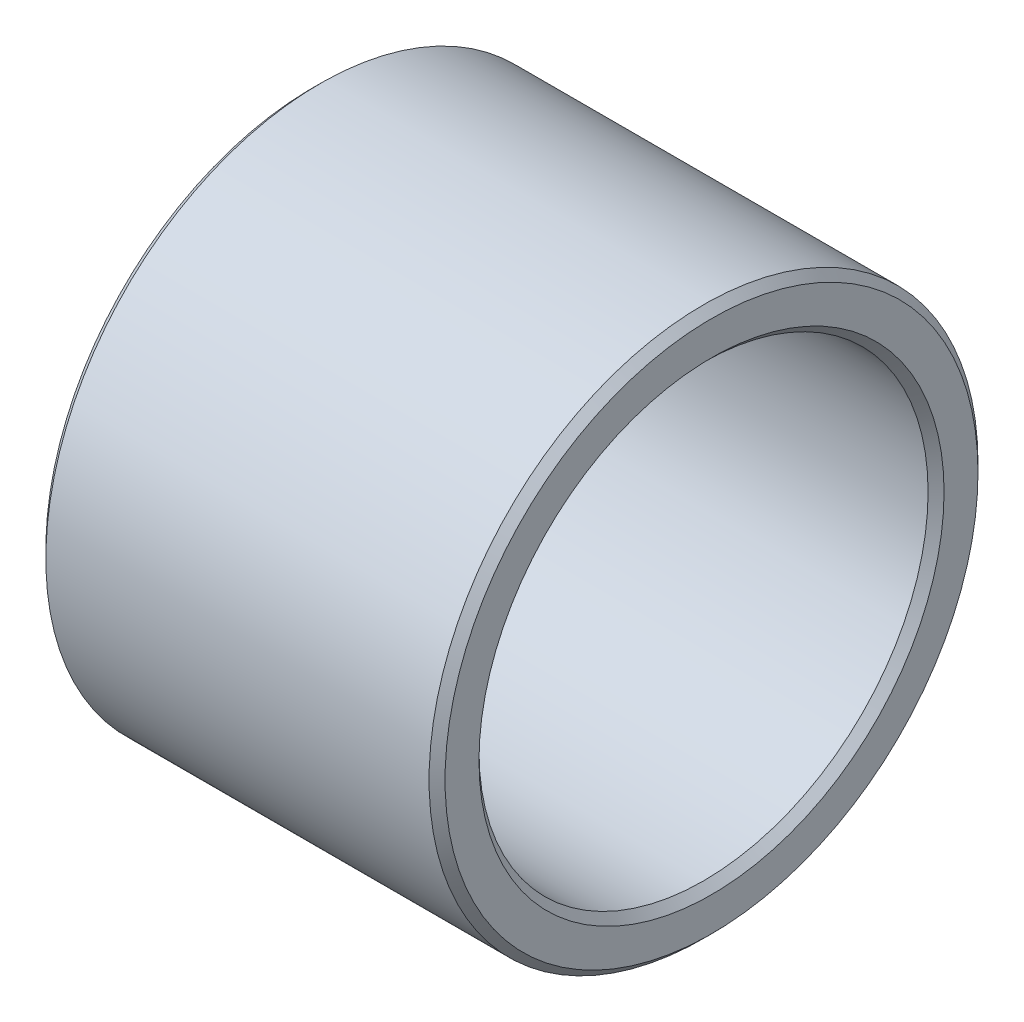
ISO-10303-21;
HEADER;
FILE_DESCRIPTION(('STEP AP214'),'2;1');
FILE_NAME('part.step','',(''),(''),'','','');
FILE_SCHEMA(('AUTOMOTIVE_DESIGN { 1 0 10303 214 1 1 1 1 }'));
ENDSEC;
DATA;
#1=APPLICATION_CONTEXT('core data for automotive mechanical design processes');
#2=APPLICATION_PROTOCOL_DEFINITION('international standard','automotive_design',2000,#1);
#3=PRODUCT_CONTEXT('',#1,'mechanical');
#4=PRODUCT('Part','Part','',(#3));
#5=PRODUCT_RELATED_PRODUCT_CATEGORY('part','',(#4));
#6=PRODUCT_DEFINITION_FORMATION('','',#4);
#7=PRODUCT_DEFINITION_CONTEXT('part definition',#1,'design');
#8=PRODUCT_DEFINITION('design','',#6,#7);
#9=PRODUCT_DEFINITION_SHAPE('','',#8);
#10=(LENGTH_UNIT() NAMED_UNIT(*) SI_UNIT(.MILLI.,.METRE.));
#11=(NAMED_UNIT(*) PLANE_ANGLE_UNIT() SI_UNIT($,.RADIAN.));
#12=(NAMED_UNIT(*) SI_UNIT($,.STERADIAN.) SOLID_ANGLE_UNIT());
#13=UNCERTAINTY_MEASURE_WITH_UNIT(LENGTH_MEASURE(1.E-05),#10,'distance_accuracy_value','');
#14=(GEOMETRIC_REPRESENTATION_CONTEXT(3) GLOBAL_UNCERTAINTY_ASSIGNED_CONTEXT((#13)) GLOBAL_UNIT_ASSIGNED_CONTEXT((#10,
#11,#12)) REPRESENTATION_CONTEXT('',''));
#15=CARTESIAN_POINT('',(0.,0.,0.));
#16=DIRECTION('',(0.,0.,1.));
#17=DIRECTION('',(1.,0.,0.));
#18=AXIS2_PLACEMENT_3D('',#15,#16,#17);
#19=CARTESIAN_POINT('',(25.4,0.,0.));
#20=DIRECTION('',(1.,0.,0.));
#21=DIRECTION('',(0.,0.,-1.));
#22=AXIS2_PLACEMENT_3D('',#19,#20,#21);
#23=PLANE('',#22);
#24=CARTESIAN_POINT('',(25.4,0.,0.));
#25=DIRECTION('',(1.,0.,0.));
#26=DIRECTION('',(0.,0.,-1.));
#27=AXIS2_PLACEMENT_3D('',#24,#25,#26);
#28=CIRCLE('',#27,14.7955);
#29=CARTESIAN_POINT('',(25.4,0.,-14.7955));
#30=VERTEX_POINT('',#29);
#31=EDGE_CURVE('E50',#30,#30,#28,.F.);
#32=ORIENTED_EDGE('',*,*,#31,.T.);
#33=EDGE_LOOP('',(#32));
#34=FACE_BOUND('',#33,.T.);
#35=CARTESIAN_POINT('',(25.4,0.,0.));
#36=DIRECTION('',(1.,0.,0.));
#37=DIRECTION('',(0.,0.,-1.));
#38=AXIS2_PLACEMENT_3D('',#35,#36,#37);
#39=CIRCLE('',#38,16.9545);
#40=CARTESIAN_POINT('',(25.4,0.,-16.9545));
#41=VERTEX_POINT('',#40);
#42=EDGE_CURVE('E53',#41,#41,#39,.T.);
#43=ORIENTED_EDGE('',*,*,#42,.T.);
#44=EDGE_LOOP('',(#43));
#45=FACE_BOUND('',#44,.T.);
#46=ADVANCED_FACE('F30',(#34,#45),#23,.T.);
#47=CARTESIAN_POINT('',(0.,0.,0.));
#48=DIRECTION('',(1.,0.,0.));
#49=DIRECTION('',(0.,0.,-1.));
#50=AXIS2_PLACEMENT_3D('',#47,#48,#49);
#51=PLANE('',#50);
#52=CARTESIAN_POINT('',(0.,0.,0.));
#53=DIRECTION('',(1.,0.,0.));
#54=DIRECTION('',(0.,0.,-1.));
#55=AXIS2_PLACEMENT_3D('',#52,#53,#54);
#56=CIRCLE('',#55,16.9545);
#57=CARTESIAN_POINT('',(0.,0.,-16.9545));
#58=VERTEX_POINT('',#57);
#59=EDGE_CURVE('E10',#58,#58,#56,.F.);
#60=ORIENTED_EDGE('',*,*,#59,.T.);
#61=EDGE_LOOP('',(#60));
#62=FACE_BOUND('',#61,.T.);
#63=CARTESIAN_POINT('',(0.,0.,0.));
#64=DIRECTION('',(1.,0.,0.));
#65=DIRECTION('',(0.,0.,-1.));
#66=AXIS2_PLACEMENT_3D('',#63,#64,#65);
#67=CIRCLE('',#66,14.7955);
#68=CARTESIAN_POINT('',(0.,0.,-14.7955));
#69=VERTEX_POINT('',#68);
#70=EDGE_CURVE('E37',#69,#69,#67,.T.);
#71=ORIENTED_EDGE('',*,*,#70,.T.);
#72=EDGE_LOOP('',(#71));
#73=FACE_BOUND('',#72,.T.);
#74=ADVANCED_FACE('F74',(#62,#73),#51,.F.);
#75=CARTESIAN_POINT('',(25.4,0.,0.));
#76=DIRECTION('',(-1.,0.,0.));
#77=DIRECTION('',(0.,0.,1.));
#78=AXIS2_PLACEMENT_3D('',#75,#76,#77);
#79=CYLINDRICAL_SURFACE('',#78,17.4625);
#80=CARTESIAN_POINT('',(24.892,0.,0.));
#81=DIRECTION('',(1.,0.,0.));
#82=DIRECTION('',(0.,0.,-1.));
#83=AXIS2_PLACEMENT_3D('',#80,#81,#82);
#84=CIRCLE('',#83,17.4625);
#85=CARTESIAN_POINT('',(24.892,0.,-17.4625));
#86=VERTEX_POINT('',#85);
#87=EDGE_CURVE('E41',#86,#86,#84,.F.);
#88=ORIENTED_EDGE('',*,*,#87,.T.);
#89=EDGE_LOOP('',(#88));
#90=FACE_BOUND('',#89,.T.);
#91=CARTESIAN_POINT('',(0.508000000000002,0.,0.));
#92=DIRECTION('',(1.,0.,0.));
#93=DIRECTION('',(0.,0.,-1.));
#94=AXIS2_PLACEMENT_3D('',#91,#92,#93);
#95=CIRCLE('',#94,17.4625);
#96=CARTESIAN_POINT('',(0.508000000000002,0.,-17.4625));
#97=VERTEX_POINT('',#96);
#98=EDGE_CURVE('E45',#97,#97,#95,.T.);
#99=ORIENTED_EDGE('',*,*,#98,.T.);
#100=EDGE_LOOP('',(#99));
#101=FACE_BOUND('',#100,.T.);
#102=ADVANCED_FACE('F80',(#90,#101),#79,.T.);
#103=CARTESIAN_POINT('',(25.4,0.,0.));
#104=DIRECTION('',(-1.,0.,0.));
#105=DIRECTION('',(0.,0.,1.));
#106=AXIS2_PLACEMENT_3D('',#103,#104,#105);
#107=CYLINDRICAL_SURFACE('',#106,14.2875);
#108=CARTESIAN_POINT('',(24.892,0.,0.));
#109=DIRECTION('',(1.,0.,0.));
#110=DIRECTION('',(0.,0.,-1.));
#111=AXIS2_PLACEMENT_3D('',#108,#109,#110);
#112=CIRCLE('',#111,14.2875);
#113=CARTESIAN_POINT('',(24.892,0.,-14.2875));
#114=VERTEX_POINT('',#113);
#115=EDGE_CURVE('E56',#114,#114,#112,.T.);
#116=ORIENTED_EDGE('',*,*,#115,.T.);
#117=EDGE_LOOP('',(#116));
#118=FACE_BOUND('',#117,.T.);
#119=CARTESIAN_POINT('',(0.508000000000005,0.,0.));
#120=DIRECTION('',(1.,0.,0.));
#121=DIRECTION('',(0.,0.,-1.));
#122=AXIS2_PLACEMENT_3D('',#119,#120,#121);
#123=CIRCLE('',#122,14.2875);
#124=CARTESIAN_POINT('',(0.508000000000005,0.,-14.2875));
#125=VERTEX_POINT('',#124);
#126=EDGE_CURVE('E59',#125,#125,#123,.F.);
#127=ORIENTED_EDGE('',*,*,#126,.T.);
#128=EDGE_LOOP('',(#127));
#129=FACE_BOUND('',#128,.T.);
#130=ADVANCED_FACE('F63',(#118,#129),#107,.F.);
#131=CARTESIAN_POINT('',(24.892,0.,0.));
#132=DIRECTION('',(1.,0.,0.));
#133=DIRECTION('',(0.,0.,-1.));
#134=AXIS2_PLACEMENT_3D('',#131,#132,#133);
#135=CONICAL_SURFACE('',#134,14.2875,0.785398163397453);
#136=ORIENTED_EDGE('',*,*,#31,.F.);
#137=EDGE_LOOP('',(#136));
#138=FACE_BOUND('',#137,.T.);
#139=ORIENTED_EDGE('',*,*,#115,.F.);
#140=EDGE_LOOP('',(#139));
#141=FACE_BOUND('',#140,.T.);
#142=ADVANCED_FACE('F88',(#138,#141),#135,.F.);
#143=CARTESIAN_POINT('',(25.4,0.,0.));
#144=DIRECTION('',(-1.,0.,0.));
#145=DIRECTION('',(0.,0.,1.));
#146=AXIS2_PLACEMENT_3D('',#143,#144,#145);
#147=CONICAL_SURFACE('',#146,16.9545,0.785398163397442);
#148=ORIENTED_EDGE('',*,*,#87,.F.);
#149=EDGE_LOOP('',(#148));
#150=FACE_BOUND('',#149,.T.);
#151=ORIENTED_EDGE('',*,*,#42,.F.);
#152=EDGE_LOOP('',(#151));
#153=FACE_BOUND('',#152,.T.);
#154=ADVANCED_FACE('F71',(#150,#153),#147,.T.);
#155=CARTESIAN_POINT('',(0.508000000000002,0.,0.));
#156=DIRECTION('',(1.,0.,0.));
#157=DIRECTION('',(0.,0.,-1.));
#158=AXIS2_PLACEMENT_3D('',#155,#156,#157);
#159=CONICAL_SURFACE('',#158,17.4625,0.785398163397448);
#160=ORIENTED_EDGE('',*,*,#59,.F.);
#161=EDGE_LOOP('',(#160));
#162=FACE_BOUND('',#161,.T.);
#163=ORIENTED_EDGE('',*,*,#98,.F.);
#164=EDGE_LOOP('',(#163));
#165=FACE_BOUND('',#164,.T.);
#166=ADVANCED_FACE('F67',(#162,#165),#159,.T.);
#167=CARTESIAN_POINT('',(0.,0.,0.));
#168=DIRECTION('',(-1.,0.,0.));
#169=DIRECTION('',(0.,0.,1.));
#170=AXIS2_PLACEMENT_3D('',#167,#168,#169);
#171=CONICAL_SURFACE('',#170,14.7955,0.785398163397448);
#172=ORIENTED_EDGE('',*,*,#126,.F.);
#173=EDGE_LOOP('',(#172));
#174=FACE_BOUND('',#173,.T.);
#175=ORIENTED_EDGE('',*,*,#70,.F.);
#176=EDGE_LOOP('',(#175));
#177=FACE_BOUND('',#176,.T.);
#178=ADVANCED_FACE('F32',(#174,#177),#171,.F.);
#179=CLOSED_SHELL('',(#46,#74,#102,#130,#142,#154,#166,#178));
#180=MANIFOLD_SOLID_BREP('B2',#179);
#181=ADVANCED_BREP_SHAPE_REPRESENTATION('',(#18,#180),#14);
#182=SHAPE_DEFINITION_REPRESENTATION(#9,#181);
ENDSEC;
END-ISO-10303-21;
